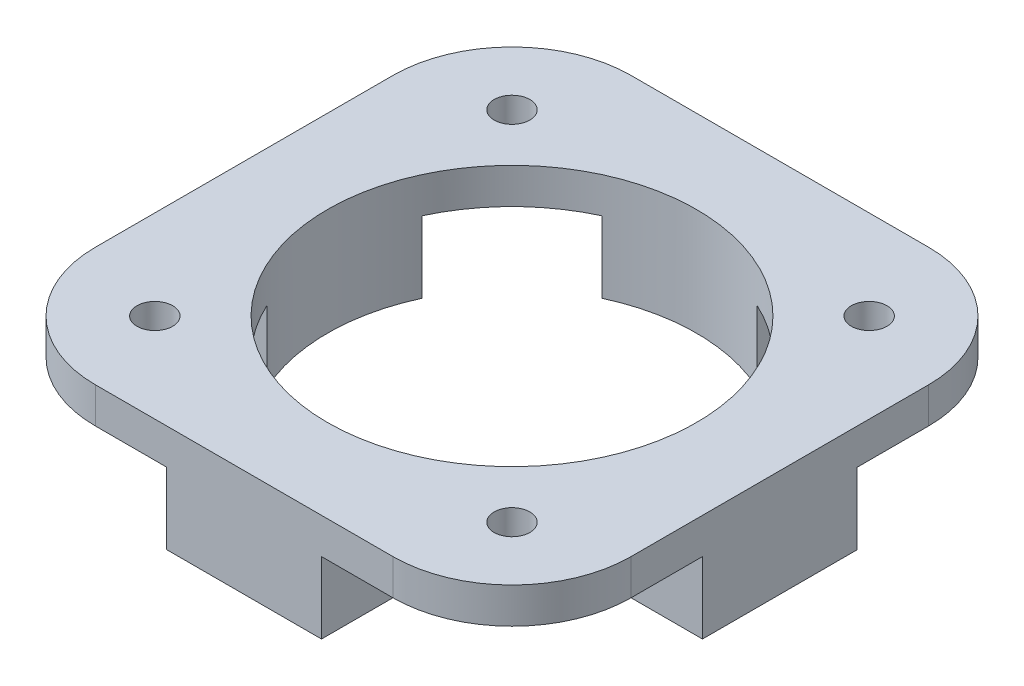
ISO-10303-21;
HEADER;
FILE_DESCRIPTION(('STEP AP214'),'2;1');
FILE_NAME('part.step','',(''),(''),'','','');
FILE_SCHEMA(('AUTOMOTIVE_DESIGN { 1 0 10303 214 1 1 1 1 }'));
ENDSEC;
DATA;
#1=APPLICATION_CONTEXT('core data for automotive mechanical design processes');
#2=APPLICATION_PROTOCOL_DEFINITION('international standard','automotive_design',2000,#1);
#3=PRODUCT_CONTEXT('',#1,'mechanical');
#4=PRODUCT('Part','Part','',(#3));
#5=PRODUCT_RELATED_PRODUCT_CATEGORY('part','',(#4));
#6=PRODUCT_DEFINITION_FORMATION('','',#4);
#7=PRODUCT_DEFINITION_CONTEXT('part definition',#1,'design');
#8=PRODUCT_DEFINITION('design','',#6,#7);
#9=PRODUCT_DEFINITION_SHAPE('','',#8);
#10=(LENGTH_UNIT() NAMED_UNIT(*) SI_UNIT(.MILLI.,.METRE.));
#11=(NAMED_UNIT(*) PLANE_ANGLE_UNIT() SI_UNIT($,.RADIAN.));
#12=(NAMED_UNIT(*) SI_UNIT($,.STERADIAN.) SOLID_ANGLE_UNIT());
#13=UNCERTAINTY_MEASURE_WITH_UNIT(LENGTH_MEASURE(1.E-05),#10,'distance_accuracy_value','');
#14=(GEOMETRIC_REPRESENTATION_CONTEXT(3) GLOBAL_UNCERTAINTY_ASSIGNED_CONTEXT((#13)) GLOBAL_UNIT_ASSIGNED_CONTEXT((#10,
#11,#12)) REPRESENTATION_CONTEXT('',''));
#15=CARTESIAN_POINT('',(0.,0.,0.));
#16=DIRECTION('',(0.,0.,1.));
#17=DIRECTION('',(1.,0.,0.));
#18=AXIS2_PLACEMENT_3D('',#15,#16,#17);
#19=CARTESIAN_POINT('',(6.99833531510106,-6.,-6.));
#20=DIRECTION('',(1.,0.,0.));
#21=DIRECTION('',(0.,0.,-1.));
#22=AXIS2_PLACEMENT_3D('',#19,#20,#21);
#23=PLANE('',#22);
#24=DIRECTION('',(0.,0.,-1.));
#25=VECTOR('',#24,1.);
#26=CARTESIAN_POINT('',(6.99833531510106,0.,-6.));
#27=LINE('',#26,#25);
#28=CARTESIAN_POINT('',(6.99833531510106,0.,-13.5729119643692));
#29=VERTEX_POINT('',#28);
#30=CARTESIAN_POINT('',(6.99833531510106,0.,-22.0016646848989));
#31=VERTEX_POINT('',#30);
#32=EDGE_CURVE('E64',#29,#31,#27,.T.);
#33=ORIENTED_EDGE('',*,*,#32,.F.);
#34=DIRECTION('',(0.,-1.,0.));
#35=VECTOR('',#34,1.);
#36=CARTESIAN_POINT('',(6.99833531510106,7.5,-13.5729119643692));
#37=LINE('',#36,#35);
#38=CARTESIAN_POINT('',(6.99833531510106,-6.,-13.5729119643692));
#39=VERTEX_POINT('',#38);
#40=EDGE_CURVE('E589',#29,#39,#37,.T.);
#41=ORIENTED_EDGE('',*,*,#40,.T.);
#42=DIRECTION('',(0.,0.,-1.));
#43=VECTOR('',#42,1.);
#44=CARTESIAN_POINT('',(6.99833531510106,-6.,-6.));
#45=LINE('',#44,#43);
#46=CARTESIAN_POINT('',(6.99833531510106,-6.,-22.0016646848989));
#47=VERTEX_POINT('',#46);
#48=EDGE_CURVE('E248',#39,#47,#45,.T.);
#49=ORIENTED_EDGE('',*,*,#48,.T.);
#50=DIRECTION('',(0.,1.,0.));
#51=VECTOR('',#50,1.);
#52=CARTESIAN_POINT('',(6.99833531510106,-6.,-22.0016646848989));
#53=LINE('',#52,#51);
#54=EDGE_CURVE('E280',#47,#31,#53,.T.);
#55=ORIENTED_EDGE('',*,*,#54,.T.);
#56=EDGE_LOOP('',(#33,#41,#49,#55));
#57=FACE_BOUND('',#56,.T.);
#58=ADVANCED_FACE('F39',(#57),#23,.T.);
#59=CARTESIAN_POINT('',(22.9983353151011,-6.,-6.));
#60=DIRECTION('',(0.,0.,-1.));
#61=DIRECTION('',(-1.,0.,0.));
#62=AXIS2_PLACEMENT_3D('',#59,#60,#61);
#63=PLANE('',#62);
#64=DIRECTION('',(-1.,0.,0.));
#65=VECTOR('',#64,1.);
#66=CARTESIAN_POINT('',(22.9983353151011,-6.,-6.));
#67=LINE('',#66,#65);
#68=CARTESIAN_POINT('',(22.9983353151011,-6.,-6.));
#69=VERTEX_POINT('',#68);
#70=CARTESIAN_POINT('',(14.5703514511247,-6.,-6.));
#71=VERTEX_POINT('',#70);
#72=EDGE_CURVE('E244',#69,#71,#67,.T.);
#73=ORIENTED_EDGE('',*,*,#72,.T.);
#74=DIRECTION('',(0.,-1.,0.));
#75=VECTOR('',#74,1.);
#76=CARTESIAN_POINT('',(14.5703514511247,7.5,-6.));
#77=LINE('',#76,#75);
#78=CARTESIAN_POINT('',(14.5703514511247,0.,-6.));
#79=VERTEX_POINT('',#78);
#80=EDGE_CURVE('E570',#71,#79,#77,.F.);
#81=ORIENTED_EDGE('',*,*,#80,.T.);
#82=DIRECTION('',(-1.,0.,0.));
#83=VECTOR('',#82,1.);
#84=CARTESIAN_POINT('',(22.9983353151011,0.,-6.));
#85=LINE('',#84,#83);
#86=CARTESIAN_POINT('',(22.9983353151011,0.,-6.));
#87=VERTEX_POINT('',#86);
#88=EDGE_CURVE('E273',#87,#79,#85,.T.);
#89=ORIENTED_EDGE('',*,*,#88,.F.);
#90=DIRECTION('',(0.,1.,0.));
#91=VECTOR('',#90,1.);
#92=CARTESIAN_POINT('',(22.9983353151011,-6.,-6.));
#93=LINE('',#92,#91);
#94=EDGE_CURVE('E284',#69,#87,#93,.T.);
#95=ORIENTED_EDGE('',*,*,#94,.F.);
#96=EDGE_LOOP('',(#73,#81,#89,#95));
#97=FACE_BOUND('',#96,.T.);
#98=ADVANCED_FACE('F490',(#97),#63,.T.);
#99=CARTESIAN_POINT('',(6.99833531510106,-6.,6.99833531510107));
#100=DIRECTION('',(0.,0.,1.));
#101=DIRECTION('',(1.,0.,0.));
#102=AXIS2_PLACEMENT_3D('',#99,#100,#101);
#103=PLANE('',#102);
#104=DIRECTION('',(1.,0.,0.));
#105=VECTOR('',#104,1.);
#106=CARTESIAN_POINT('',(6.99833531510106,0.,6.99833531510107));
#107=LINE('',#106,#105);
#108=CARTESIAN_POINT('',(14.5695825945714,0.,6.99833531510107));
#109=VERTEX_POINT('',#108);
#110=CARTESIAN_POINT('',(22.9983353151011,0.,6.99833531510107));
#111=VERTEX_POINT('',#110);
#112=EDGE_CURVE('E270',#109,#111,#107,.T.);
#113=ORIENTED_EDGE('',*,*,#112,.F.);
#114=DIRECTION('',(0.,-1.,0.));
#115=VECTOR('',#114,1.);
#116=CARTESIAN_POINT('',(14.5695825945714,7.5,6.99833531510107));
#117=LINE('',#116,#115);
#118=CARTESIAN_POINT('',(14.5695825945714,-6.,6.99833531510107));
#119=VERTEX_POINT('',#118);
#120=EDGE_CURVE('E563',#109,#119,#117,.T.);
#121=ORIENTED_EDGE('',*,*,#120,.T.);
#122=DIRECTION('',(1.,0.,0.));
#123=VECTOR('',#122,1.);
#124=CARTESIAN_POINT('',(6.99833531510106,-6.,6.99833531510107));
#125=LINE('',#124,#123);
#126=CARTESIAN_POINT('',(22.9983353151011,-6.,6.99833531510107));
#127=VERTEX_POINT('',#126);
#128=EDGE_CURVE('E237',#119,#127,#125,.T.);
#129=ORIENTED_EDGE('',*,*,#128,.T.);
#130=DIRECTION('',(0.,1.,0.));
#131=VECTOR('',#130,1.);
#132=CARTESIAN_POINT('',(22.9983353151011,-6.,6.99833531510107));
#133=LINE('',#132,#131);
#134=EDGE_CURVE('E287',#127,#111,#133,.T.);
#135=ORIENTED_EDGE('',*,*,#134,.T.);
#136=EDGE_LOOP('',(#113,#121,#129,#135));
#137=FACE_BOUND('',#136,.T.);
#138=ADVANCED_FACE('F496',(#137),#103,.T.);
#139=CARTESIAN_POINT('',(6.99833531510106,-6.,22.9983353151011));
#140=DIRECTION('',(1.,0.,0.));
#141=DIRECTION('',(0.,0.,-1.));
#142=AXIS2_PLACEMENT_3D('',#139,#140,#141);
#143=PLANE('',#142);
#144=DIRECTION('',(0.,0.,-1.));
#145=VECTOR('',#144,1.);
#146=CARTESIAN_POINT('',(6.99833531510106,-6.,22.9983353151011));
#147=LINE('',#146,#145);
#148=CARTESIAN_POINT('',(6.99833531510106,-6.,22.9983353151011));
#149=VERTEX_POINT('',#148);
#150=CARTESIAN_POINT('',(6.99833531510106,-6.,14.5695825945714));
#151=VERTEX_POINT('',#150);
#152=EDGE_CURVE('E228',#149,#151,#147,.T.);
#153=ORIENTED_EDGE('',*,*,#152,.T.);
#154=DIRECTION('',(0.,-1.,0.));
#155=VECTOR('',#154,1.);
#156=CARTESIAN_POINT('',(6.99833531510106,7.5,14.5695825945714));
#157=LINE('',#156,#155);
#158=CARTESIAN_POINT('',(6.99833531510106,0.,14.5695825945714));
#159=VERTEX_POINT('',#158);
#160=EDGE_CURVE('E56',#151,#159,#157,.F.);
#161=ORIENTED_EDGE('',*,*,#160,.T.);
#162=DIRECTION('',(0.,0.,-1.));
#163=VECTOR('',#162,1.);
#164=CARTESIAN_POINT('',(6.99833531510106,0.,22.9983353151011));
#165=LINE('',#164,#163);
#166=CARTESIAN_POINT('',(6.99833531510106,0.,22.9983353151011));
#167=VERTEX_POINT('',#166);
#168=EDGE_CURVE('E266',#167,#159,#165,.T.);
#169=ORIENTED_EDGE('',*,*,#168,.F.);
#170=DIRECTION('',(0.,1.,0.));
#171=VECTOR('',#170,1.);
#172=CARTESIAN_POINT('',(6.99833531510106,-6.,22.9983353151011));
#173=LINE('',#172,#171);
#174=EDGE_CURVE('E291',#149,#167,#173,.T.);
#175=ORIENTED_EDGE('',*,*,#174,.F.);
#176=EDGE_LOOP('',(#153,#161,#169,#175));
#177=FACE_BOUND('',#176,.T.);
#178=ADVANCED_FACE('F504',(#177),#143,.T.);
#179=CARTESIAN_POINT('',(-6.00166468489894,-6.,6.99833531510107));
#180=DIRECTION('',(-1.,0.,0.));
#181=DIRECTION('',(0.,0.,1.));
#182=AXIS2_PLACEMENT_3D('',#179,#180,#181);
#183=PLANE('',#182);
#184=DIRECTION('',(0.,0.,1.));
#185=VECTOR('',#184,1.);
#186=CARTESIAN_POINT('',(-6.00166468489894,0.,6.99833531510107));
#187=LINE('',#186,#185);
#188=CARTESIAN_POINT('',(-6.00166468489894,0.,14.5695825945714));
#189=VERTEX_POINT('',#188);
#190=CARTESIAN_POINT('',(-6.00166468489894,0.,22.9983353151011));
#191=VERTEX_POINT('',#190);
#192=EDGE_CURVE('E216',#189,#191,#187,.T.);
#193=ORIENTED_EDGE('',*,*,#192,.F.);
#194=DIRECTION('',(0.,-1.,0.));
#195=VECTOR('',#194,1.);
#196=CARTESIAN_POINT('',(-6.00166468489894,7.5,14.5695825945714));
#197=LINE('',#196,#195);
#198=CARTESIAN_POINT('',(-6.00166468489894,-6.,14.5695825945714));
#199=VERTEX_POINT('',#198);
#200=EDGE_CURVE('E201',#189,#199,#197,.T.);
#201=ORIENTED_EDGE('',*,*,#200,.T.);
#202=DIRECTION('',(0.,0.,1.));
#203=VECTOR('',#202,1.);
#204=CARTESIAN_POINT('',(-6.00166468489894,-6.,6.99833531510107));
#205=LINE('',#204,#203);
#206=CARTESIAN_POINT('',(-6.00166468489894,-6.,22.9983353151011));
#207=VERTEX_POINT('',#206);
#208=EDGE_CURVE('E214',#199,#207,#205,.T.);
#209=ORIENTED_EDGE('',*,*,#208,.T.);
#210=DIRECTION('',(0.,1.,0.));
#211=VECTOR('',#210,1.);
#212=CARTESIAN_POINT('',(-6.00166468489894,-6.,22.9983353151011));
#213=LINE('',#212,#211);
#214=EDGE_CURVE('E294',#207,#191,#213,.T.);
#215=ORIENTED_EDGE('',*,*,#214,.T.);
#216=EDGE_LOOP('',(#193,#201,#209,#215));
#217=FACE_BOUND('',#216,.T.);
#218=ADVANCED_FACE('F212',(#217),#183,.T.);
#219=CARTESIAN_POINT('',(-22.0016646848989,-6.,6.99833531510107));
#220=DIRECTION('',(0.,0.,1.));
#221=DIRECTION('',(1.,0.,0.));
#222=AXIS2_PLACEMENT_3D('',#219,#220,#221);
#223=PLANE('',#222);
#224=DIRECTION('',(1.,0.,0.));
#225=VECTOR('',#224,1.);
#226=CARTESIAN_POINT('',(-22.0016646848989,-6.,6.99833531510107));
#227=LINE('',#226,#225);
#228=CARTESIAN_POINT('',(-22.0016646848989,-6.,6.99833531510107));
#229=VERTEX_POINT('',#228);
#230=CARTESIAN_POINT('',(-13.5729119643692,-6.,6.99833531510107));
#231=VERTEX_POINT('',#230);
#232=EDGE_CURVE('E224',#229,#231,#227,.T.);
#233=ORIENTED_EDGE('',*,*,#232,.T.);
#234=DIRECTION('',(0.,-1.,0.));
#235=VECTOR('',#234,1.);
#236=CARTESIAN_POINT('',(-13.5729119643692,7.5,6.99833531510107));
#237=LINE('',#236,#235);
#238=CARTESIAN_POINT('',(-13.5729119643692,0.,6.99833531510107));
#239=VERTEX_POINT('',#238);
#240=EDGE_CURVE('E611',#231,#239,#237,.F.);
#241=ORIENTED_EDGE('',*,*,#240,.T.);
#242=DIRECTION('',(1.,0.,0.));
#243=VECTOR('',#242,1.);
#244=CARTESIAN_POINT('',(-22.0016646848989,0.,6.99833531510107));
#245=LINE('',#244,#243);
#246=CARTESIAN_POINT('',(-22.0016646848989,0.,6.99833531510107));
#247=VERTEX_POINT('',#246);
#248=EDGE_CURVE('E260',#247,#239,#245,.T.);
#249=ORIENTED_EDGE('',*,*,#248,.F.);
#250=DIRECTION('',(0.,1.,0.));
#251=VECTOR('',#250,1.);
#252=CARTESIAN_POINT('',(-22.0016646848989,-6.,6.99833531510107));
#253=LINE('',#252,#251);
#254=EDGE_CURVE('E297',#229,#247,#253,.T.);
#255=ORIENTED_EDGE('',*,*,#254,.F.);
#256=EDGE_LOOP('',(#233,#241,#249,#255));
#257=FACE_BOUND('',#256,.T.);
#258=ADVANCED_FACE('F511',(#257),#223,.T.);
#259=CARTESIAN_POINT('',(-6.,-6.,-6.));
#260=DIRECTION('',(0.,0.,-1.));
#261=DIRECTION('',(-1.,0.,0.));
#262=AXIS2_PLACEMENT_3D('',#259,#260,#261);
#263=PLANE('',#262);
#264=DIRECTION('',(-1.,0.,0.));
#265=VECTOR('',#264,1.);
#266=CARTESIAN_POINT('',(-6.,0.,-6.));
#267=LINE('',#266,#265);
#268=CARTESIAN_POINT('',(-13.5736808209226,0.,-6.));
#269=VERTEX_POINT('',#268);
#270=CARTESIAN_POINT('',(-22.0016646848989,0.,-6.));
#271=VERTEX_POINT('',#270);
#272=EDGE_CURVE('E256',#269,#271,#267,.T.);
#273=ORIENTED_EDGE('',*,*,#272,.F.);
#274=DIRECTION('',(0.,-1.,0.));
#275=VECTOR('',#274,1.);
#276=CARTESIAN_POINT('',(-13.5736808209226,7.5,-6.));
#277=LINE('',#276,#275);
#278=CARTESIAN_POINT('',(-13.5736808209226,-6.,-6.));
#279=VERTEX_POINT('',#278);
#280=EDGE_CURVE('E573',#269,#279,#277,.T.);
#281=ORIENTED_EDGE('',*,*,#280,.T.);
#282=DIRECTION('',(-1.,0.,0.));
#283=VECTOR('',#282,1.);
#284=CARTESIAN_POINT('',(-6.,-6.,-6.));
#285=LINE('',#284,#283);
#286=CARTESIAN_POINT('',(-22.0016646848989,-6.,-6.));
#287=VERTEX_POINT('',#286);
#288=EDGE_CURVE('E602',#279,#287,#285,.T.);
#289=ORIENTED_EDGE('',*,*,#288,.T.);
#290=DIRECTION('',(0.,1.,0.));
#291=VECTOR('',#290,1.);
#292=CARTESIAN_POINT('',(-22.0016646848989,-6.,-6.));
#293=LINE('',#292,#291);
#294=EDGE_CURVE('E300',#287,#271,#293,.T.);
#295=ORIENTED_EDGE('',*,*,#294,.T.);
#296=EDGE_LOOP('',(#273,#281,#289,#295));
#297=FACE_BOUND('',#296,.T.);
#298=ADVANCED_FACE('F514',(#297),#263,.T.);
#299=CARTESIAN_POINT('',(-6.,-6.,-22.0016646848989));
#300=DIRECTION('',(-1.,0.,0.));
#301=DIRECTION('',(0.,0.,1.));
#302=AXIS2_PLACEMENT_3D('',#299,#300,#301);
#303=PLANE('',#302);
#304=DIRECTION('',(0.,0.,1.));
#305=VECTOR('',#304,1.);
#306=CARTESIAN_POINT('',(-6.,-6.,-22.0016646848989));
#307=LINE('',#306,#305);
#308=CARTESIAN_POINT('',(-6.,-6.,-22.0016646848989));
#309=VERTEX_POINT('',#308);
#310=CARTESIAN_POINT('',(-6.,-6.,-13.5736808209226));
#311=VERTEX_POINT('',#310);
#312=EDGE_CURVE('E598',#309,#311,#307,.T.);
#313=ORIENTED_EDGE('',*,*,#312,.T.);
#314=DIRECTION('',(0.,-1.,0.));
#315=VECTOR('',#314,1.);
#316=CARTESIAN_POINT('',(-6.,7.5,-13.5736808209226));
#317=LINE('',#316,#315);
#318=CARTESIAN_POINT('',(-6.,0.,-13.5736808209226));
#319=VERTEX_POINT('',#318);
#320=EDGE_CURVE('E585',#311,#319,#317,.F.);
#321=ORIENTED_EDGE('',*,*,#320,.T.);
#322=DIRECTION('',(0.,0.,1.));
#323=VECTOR('',#322,1.);
#324=CARTESIAN_POINT('',(-6.,0.,-22.0016646848989));
#325=LINE('',#324,#323);
#326=CARTESIAN_POINT('',(-6.,0.,-22.0016646848989));
#327=VERTEX_POINT('',#326);
#328=EDGE_CURVE('E252',#327,#319,#325,.T.);
#329=ORIENTED_EDGE('',*,*,#328,.F.);
#330=DIRECTION('',(0.,1.,0.));
#331=VECTOR('',#330,1.);
#332=CARTESIAN_POINT('',(-6.,-6.,-22.0016646848989));
#333=LINE('',#332,#331);
#334=EDGE_CURVE('E251',#309,#327,#333,.T.);
#335=ORIENTED_EDGE('',*,*,#334,.F.);
#336=EDGE_LOOP('',(#313,#321,#329,#335));
#337=FACE_BOUND('',#336,.T.);
#338=ADVANCED_FACE('F518',(#337),#303,.T.);
#339=CARTESIAN_POINT('',(0.,-6.,0.));
#340=DIRECTION('',(0.,1.,0.));
#341=DIRECTION('',(0.,0.,1.));
#342=AXIS2_PLACEMENT_3D('',#339,#340,#341);
#343=PLANE('',#342);
#344=CARTESIAN_POINT('',(0.498335315101075,-6.,0.498335315101071));
#345=DIRECTION('',(0.,1.,0.));
#346=DIRECTION('',(0.,0.,1.));
#347=AXIS2_PLACEMENT_3D('',#344,#345,#346);
#348=CIRCLE('',#347,15.5);
#349=EDGE_CURVE('E11',#231,#279,#348,.F.);
#350=ORIENTED_EDGE('',*,*,#349,.F.);
#351=ORIENTED_EDGE('',*,*,#232,.F.);
#352=DIRECTION('',(0.,0.,1.));
#353=VECTOR('',#352,1.);
#354=CARTESIAN_POINT('',(-22.0016646848989,-6.,-6.));
#355=LINE('',#354,#353);
#356=EDGE_CURVE('E231',#287,#229,#355,.T.);
#357=ORIENTED_EDGE('',*,*,#356,.F.);
#358=ORIENTED_EDGE('',*,*,#288,.F.);
#359=EDGE_LOOP('',(#350,#351,#357,#358));
#360=FACE_BOUND('',#359,.T.);
#361=ADVANCED_FACE('F522',(#360),#343,.F.);
#362=EDGE_CURVE('E49',#311,#39,#348,.F.);
#363=ORIENTED_EDGE('',*,*,#362,.F.);
#364=ORIENTED_EDGE('',*,*,#312,.F.);
#365=DIRECTION('',(-1.,0.,0.));
#366=VECTOR('',#365,1.);
#367=CARTESIAN_POINT('',(-6.,-6.,-22.0016646848989));
#368=LINE('',#367,#366);
#369=EDGE_CURVE('E279',#47,#309,#368,.T.);
#370=ORIENTED_EDGE('',*,*,#369,.F.);
#371=ORIENTED_EDGE('',*,*,#48,.F.);
#372=EDGE_LOOP('',(#363,#364,#370,#371));
#373=FACE_BOUND('',#372,.T.);
#374=ADVANCED_FACE('F633',(#373),#343,.F.);
#375=EDGE_CURVE('E208',#71,#119,#348,.F.);
#376=ORIENTED_EDGE('',*,*,#375,.F.);
#377=ORIENTED_EDGE('',*,*,#72,.F.);
#378=DIRECTION('',(0.,0.,-1.));
#379=VECTOR('',#378,1.);
#380=CARTESIAN_POINT('',(22.9983353151011,-6.,-6.));
#381=LINE('',#380,#379);
#382=EDGE_CURVE('E240',#127,#69,#381,.T.);
#383=ORIENTED_EDGE('',*,*,#382,.F.);
#384=ORIENTED_EDGE('',*,*,#128,.F.);
#385=EDGE_LOOP('',(#376,#377,#383,#384));
#386=FACE_BOUND('',#385,.T.);
#387=ADVANCED_FACE('F544',(#386),#343,.F.);
#388=CARTESIAN_POINT('',(12.9983353151011,0.,-12.0016646848989));
#389=DIRECTION('',(0.,1.,0.));
#390=DIRECTION('',(0.,0.,1.));
#391=AXIS2_PLACEMENT_3D('',#388,#389,#390);
#392=PLANE('',#391);
#393=CARTESIAN_POINT('',(0.498335315101075,0.,0.498335315101071));
#394=DIRECTION('',(0.,1.,0.));
#395=DIRECTION('',(0.,0.,1.));
#396=AXIS2_PLACEMENT_3D('',#393,#394,#395);
#397=CIRCLE('',#396,15.5);
#398=EDGE_CURVE('E577',#269,#319,#397,.F.);
#399=ORIENTED_EDGE('',*,*,#398,.F.);
#400=ORIENTED_EDGE('',*,*,#272,.T.);
#401=DIRECTION('',(0.,0.,1.));
#402=VECTOR('',#401,1.);
#403=CARTESIAN_POINT('',(-22.0016646848989,0.,12.998335315101));
#404=LINE('',#403,#402);
#405=CARTESIAN_POINT('',(-22.0016646848989,0.,-12.0016646848989));
#406=VERTEX_POINT('',#405);
#407=EDGE_CURVE('E377',#406,#271,#404,.T.);
#408=ORIENTED_EDGE('',*,*,#407,.F.);
#409=CARTESIAN_POINT('',(-12.0016646848989,0.,-12.0016646848989));
#410=DIRECTION('',(0.,1.,0.));
#411=DIRECTION('',(0.,0.,1.));
#412=AXIS2_PLACEMENT_3D('',#409,#410,#411);
#413=CIRCLE('',#412,10.);
#414=CARTESIAN_POINT('',(-12.0016646848989,0.,-22.0016646848989));
#415=VERTEX_POINT('',#414);
#416=EDGE_CURVE('E373',#415,#406,#413,.T.);
#417=ORIENTED_EDGE('',*,*,#416,.F.);
#418=DIRECTION('',(-1.,0.,0.));
#419=VECTOR('',#418,1.);
#420=CARTESIAN_POINT('',(12.998335315101,0.,-22.0016646848989));
#421=LINE('',#420,#419);
#422=EDGE_CURVE('E368',#327,#415,#421,.T.);
#423=ORIENTED_EDGE('',*,*,#422,.F.);
#424=ORIENTED_EDGE('',*,*,#328,.T.);
#425=EDGE_LOOP('',(#399,#400,#408,#417,#423,#424));
#426=FACE_BOUND('',#425,.T.);
#427=CARTESIAN_POINT('',(-14.5016646848989,0.,-14.5016646848989));
#428=DIRECTION('',(0.,1.,0.));
#429=DIRECTION('',(0.,0.,1.));
#430=AXIS2_PLACEMENT_3D('',#427,#428,#429);
#431=CIRCLE('',#430,1.5);
#432=CARTESIAN_POINT('',(-14.5016646848989,0.,-13.0016646848989));
#433=VERTEX_POINT('',#432);
#434=EDGE_CURVE('E326',#433,#433,#431,.T.);
#435=ORIENTED_EDGE('',*,*,#434,.T.);
#436=EDGE_LOOP('',(#435));
#437=FACE_BOUND('',#436,.T.);
#438=ADVANCED_FACE('F453',(#426,#437),#392,.F.);
#439=CARTESIAN_POINT('',(0.498335315101075,0.,0.498335315101071));
#440=DIRECTION('',(0.,1.,0.));
#441=DIRECTION('',(0.,0.,1.));
#442=AXIS2_PLACEMENT_3D('',#439,#440,#441);
#443=CIRCLE('',#442,15.5);
#444=EDGE_CURVE('E560',#189,#239,#443,.F.);
#445=ORIENTED_EDGE('',*,*,#444,.F.);
#446=ORIENTED_EDGE('',*,*,#192,.T.);
#447=DIRECTION('',(1.,0.,0.));
#448=VECTOR('',#447,1.);
#449=CARTESIAN_POINT('',(12.998335315101,0.,22.9983353151011));
#450=LINE('',#449,#448);
#451=CARTESIAN_POINT('',(-12.0016646848989,0.,22.9983353151011));
#452=VERTEX_POINT('',#451);
#453=EDGE_CURVE('E385',#452,#191,#450,.T.);
#454=ORIENTED_EDGE('',*,*,#453,.F.);
#455=CARTESIAN_POINT('',(-12.0016646848989,0.,12.9983353151011));
#456=DIRECTION('',(0.,1.,0.));
#457=DIRECTION('',(0.,0.,-1.));
#458=AXIS2_PLACEMENT_3D('',#455,#456,#457);
#459=CIRCLE('',#458,10.);
#460=CARTESIAN_POINT('',(-22.0016646848989,0.,12.998335315101));
#461=VERTEX_POINT('',#460);
#462=EDGE_CURVE('E381',#461,#452,#459,.T.);
#463=ORIENTED_EDGE('',*,*,#462,.F.);
#464=EDGE_CURVE('E376',#247,#461,#404,.T.);
#465=ORIENTED_EDGE('',*,*,#464,.F.);
#466=ORIENTED_EDGE('',*,*,#248,.T.);
#467=EDGE_LOOP('',(#445,#446,#454,#463,#465,#466));
#468=FACE_BOUND('',#467,.T.);
#469=CARTESIAN_POINT('',(-14.5016646848989,0.,15.4983353151011));
#470=DIRECTION('',(0.,1.,0.));
#471=DIRECTION('',(0.,0.,-1.));
#472=AXIS2_PLACEMENT_3D('',#469,#470,#471);
#473=CIRCLE('',#472,1.5);
#474=CARTESIAN_POINT('',(-14.5016646848989,0.,13.9983353151011));
#475=VERTEX_POINT('',#474);
#476=EDGE_CURVE('E283',#475,#475,#473,.T.);
#477=ORIENTED_EDGE('',*,*,#476,.T.);
#478=EDGE_LOOP('',(#477));
#479=FACE_BOUND('',#478,.T.);
#480=ADVANCED_FACE('F543',(#468,#479),#392,.F.);
#481=CARTESIAN_POINT('',(0.498335315101075,0.,0.498335315101071));
#482=DIRECTION('',(0.,1.,0.));
#483=DIRECTION('',(0.,0.,1.));
#484=AXIS2_PLACEMENT_3D('',#481,#482,#483);
#485=CIRCLE('',#484,15.5);
#486=EDGE_CURVE('E553',#109,#159,#485,.F.);
#487=ORIENTED_EDGE('',*,*,#486,.F.);
#488=ORIENTED_EDGE('',*,*,#112,.T.);
#489=DIRECTION('',(0.,0.,-1.));
#490=VECTOR('',#489,1.);
#491=CARTESIAN_POINT('',(22.9983353151011,0.,12.998335315101));
#492=LINE('',#491,#490);
#493=CARTESIAN_POINT('',(22.9983353151011,0.,12.998335315101));
#494=VERTEX_POINT('',#493);
#495=EDGE_CURVE('E343',#494,#111,#492,.T.);
#496=ORIENTED_EDGE('',*,*,#495,.F.);
#497=CARTESIAN_POINT('',(12.9983353151011,0.,12.9983353151011));
#498=DIRECTION('',(0.,1.,0.));
#499=DIRECTION('',(0.,0.,1.));
#500=AXIS2_PLACEMENT_3D('',#497,#498,#499);
#501=CIRCLE('',#500,10.);
#502=CARTESIAN_POINT('',(12.998335315101,0.,22.9983353151011));
#503=VERTEX_POINT('',#502);
#504=EDGE_CURVE('E389',#503,#494,#501,.T.);
#505=ORIENTED_EDGE('',*,*,#504,.F.);
#506=EDGE_CURVE('E384',#167,#503,#450,.T.);
#507=ORIENTED_EDGE('',*,*,#506,.F.);
#508=ORIENTED_EDGE('',*,*,#168,.T.);
#509=EDGE_LOOP('',(#487,#488,#496,#505,#507,#508));
#510=FACE_BOUND('',#509,.T.);
#511=CARTESIAN_POINT('',(15.4983353151011,0.,15.4983353151011));
#512=DIRECTION('',(0.,1.,0.));
#513=DIRECTION('',(0.,0.,1.));
#514=AXIS2_PLACEMENT_3D('',#511,#512,#513);
#515=CIRCLE('',#514,1.5);
#516=CARTESIAN_POINT('',(15.4983353151011,0.,16.9983353151011));
#517=VERTEX_POINT('',#516);
#518=EDGE_CURVE('E310',#517,#517,#515,.T.);
#519=ORIENTED_EDGE('',*,*,#518,.T.);
#520=EDGE_LOOP('',(#519));
#521=FACE_BOUND('',#520,.T.);
#522=ADVANCED_FACE('F536',(#510,#521),#392,.F.);
#523=CARTESIAN_POINT('',(12.9983353151011,3.,-12.0016646848989));
#524=DIRECTION('',(0.,1.,0.));
#525=DIRECTION('',(0.,0.,1.));
#526=AXIS2_PLACEMENT_3D('',#523,#524,#525);
#527=PLANE('',#526);
#528=CARTESIAN_POINT('',(0.498335315101075,3.,0.498335315101071));
#529=DIRECTION('',(0.,1.,0.));
#530=DIRECTION('',(0.,0.,1.));
#531=AXIS2_PLACEMENT_3D('',#528,#529,#530);
#532=CIRCLE('',#531,15.5);
#533=CARTESIAN_POINT('',(0.498335315101075,3.,15.9983353151011));
#534=VERTEX_POINT('',#533);
#535=EDGE_CURVE('E257',#534,#534,#532,.F.);
#536=ORIENTED_EDGE('',*,*,#535,.T.);
#537=EDGE_LOOP('',(#536));
#538=FACE_BOUND('',#537,.T.);
#539=CARTESIAN_POINT('',(15.4983353151011,3.,15.4983353151011));
#540=DIRECTION('',(0.,1.,0.));
#541=DIRECTION('',(0.,0.,1.));
#542=AXIS2_PLACEMENT_3D('',#539,#540,#541);
#543=CIRCLE('',#542,1.5);
#544=CARTESIAN_POINT('',(15.4983353151011,3.,16.9983353151011));
#545=VERTEX_POINT('',#544);
#546=EDGE_CURVE('E314',#545,#545,#543,.T.);
#547=ORIENTED_EDGE('',*,*,#546,.F.);
#548=EDGE_LOOP('',(#547));
#549=FACE_BOUND('',#548,.T.);
#550=CARTESIAN_POINT('',(-14.5016646848989,3.,-14.5016646848989));
#551=DIRECTION('',(0.,1.,0.));
#552=DIRECTION('',(0.,0.,1.));
#553=AXIS2_PLACEMENT_3D('',#550,#551,#552);
#554=CIRCLE('',#553,1.5);
#555=CARTESIAN_POINT('',(-14.5016646848989,3.,-13.0016646848989));
#556=VERTEX_POINT('',#555);
#557=EDGE_CURVE('E330',#556,#556,#554,.T.);
#558=ORIENTED_EDGE('',*,*,#557,.F.);
#559=EDGE_LOOP('',(#558));
#560=FACE_BOUND('',#559,.T.);
#561=CARTESIAN_POINT('',(12.9983353151011,3.,-12.0016646848989));
#562=DIRECTION('',(0.,1.,0.));
#563=DIRECTION('',(0.,0.,1.));
#564=AXIS2_PLACEMENT_3D('',#561,#562,#563);
#565=CIRCLE('',#564,10.);
#566=CARTESIAN_POINT('',(22.9983353151011,3.,-12.0016646848989));
#567=VERTEX_POINT('',#566);
#568=CARTESIAN_POINT('',(12.998335315101,3.,-22.0016646848989));
#569=VERTEX_POINT('',#568);
#570=EDGE_CURVE('E338',#567,#569,#565,.T.);
#571=ORIENTED_EDGE('',*,*,#570,.T.);
#572=DIRECTION('',(-1.,0.,0.));
#573=VECTOR('',#572,1.);
#574=CARTESIAN_POINT('',(12.998335315101,3.,-22.0016646848989));
#575=LINE('',#574,#573);
#576=CARTESIAN_POINT('',(-12.0016646848989,3.,-22.0016646848989));
#577=VERTEX_POINT('',#576);
#578=EDGE_CURVE('E342',#569,#577,#575,.T.);
#579=ORIENTED_EDGE('',*,*,#578,.T.);
#580=CARTESIAN_POINT('',(-12.0016646848989,3.,-12.0016646848989));
#581=DIRECTION('',(0.,1.,0.));
#582=DIRECTION('',(0.,0.,1.));
#583=AXIS2_PLACEMENT_3D('',#580,#581,#582);
#584=CIRCLE('',#583,10.);
#585=CARTESIAN_POINT('',(-22.0016646848989,3.,-12.0016646848989));
#586=VERTEX_POINT('',#585);
#587=EDGE_CURVE('E346',#577,#586,#584,.T.);
#588=ORIENTED_EDGE('',*,*,#587,.T.);
#589=DIRECTION('',(0.,0.,1.));
#590=VECTOR('',#589,1.);
#591=CARTESIAN_POINT('',(-22.0016646848989,3.,12.998335315101));
#592=LINE('',#591,#590);
#593=CARTESIAN_POINT('',(-22.0016646848989,3.,12.998335315101));
#594=VERTEX_POINT('',#593);
#595=EDGE_CURVE('E349',#586,#594,#592,.T.);
#596=ORIENTED_EDGE('',*,*,#595,.T.);
#597=CARTESIAN_POINT('',(-12.0016646848989,3.,12.9983353151011));
#598=DIRECTION('',(0.,1.,0.));
#599=DIRECTION('',(0.,0.,-1.));
#600=AXIS2_PLACEMENT_3D('',#597,#598,#599);
#601=CIRCLE('',#600,10.);
#602=CARTESIAN_POINT('',(-12.0016646848989,3.,22.9983353151011));
#603=VERTEX_POINT('',#602);
#604=EDGE_CURVE('E352',#594,#603,#601,.T.);
#605=ORIENTED_EDGE('',*,*,#604,.T.);
#606=DIRECTION('',(1.,0.,0.));
#607=VECTOR('',#606,1.);
#608=CARTESIAN_POINT('',(12.998335315101,3.,22.9983353151011));
#609=LINE('',#608,#607);
#610=CARTESIAN_POINT('',(12.998335315101,3.,22.9983353151011));
#611=VERTEX_POINT('',#610);
#612=EDGE_CURVE('E355',#603,#611,#609,.T.);
#613=ORIENTED_EDGE('',*,*,#612,.T.);
#614=CARTESIAN_POINT('',(12.9983353151011,3.,12.9983353151011));
#615=DIRECTION('',(0.,1.,0.));
#616=DIRECTION('',(0.,0.,1.));
#617=AXIS2_PLACEMENT_3D('',#614,#615,#616);
#618=CIRCLE('',#617,10.);
#619=CARTESIAN_POINT('',(22.9983353151011,3.,12.998335315101));
#620=VERTEX_POINT('',#619);
#621=EDGE_CURVE('E358',#611,#620,#618,.T.);
#622=ORIENTED_EDGE('',*,*,#621,.T.);
#623=DIRECTION('',(0.,0.,-1.));
#624=VECTOR('',#623,1.);
#625=CARTESIAN_POINT('',(22.9983353151011,3.,12.998335315101));
#626=LINE('',#625,#624);
#627=EDGE_CURVE('E361',#620,#567,#626,.T.);
#628=ORIENTED_EDGE('',*,*,#627,.T.);
#629=EDGE_LOOP('',(#571,#579,#588,#596,#605,#613,#622,#628));
#630=FACE_BOUND('',#629,.T.);
#631=CARTESIAN_POINT('',(15.4983353151011,3.,-14.5016646848989));
#632=DIRECTION('',(0.,1.,0.));
#633=DIRECTION('',(0.,0.,-1.));
#634=AXIS2_PLACEMENT_3D('',#631,#632,#633);
#635=CIRCLE('',#634,1.5);
#636=CARTESIAN_POINT('',(15.4983353151011,3.,-16.0016646848989));
#637=VERTEX_POINT('',#636);
#638=EDGE_CURVE('E322',#637,#637,#635,.T.);
#639=ORIENTED_EDGE('',*,*,#638,.F.);
#640=EDGE_LOOP('',(#639));
#641=FACE_BOUND('',#640,.T.);
#642=CARTESIAN_POINT('',(-14.5016646848989,3.,15.4983353151011));
#643=DIRECTION('',(0.,1.,0.));
#644=DIRECTION('',(0.,0.,-1.));
#645=AXIS2_PLACEMENT_3D('',#642,#643,#644);
#646=CIRCLE('',#645,1.5);
#647=CARTESIAN_POINT('',(-14.5016646848989,3.,13.9983353151011));
#648=VERTEX_POINT('',#647);
#649=EDGE_CURVE('E306',#648,#648,#646,.T.);
#650=ORIENTED_EDGE('',*,*,#649,.F.);
#651=EDGE_LOOP('',(#650));
#652=FACE_BOUND('',#651,.T.);
#653=ADVANCED_FACE('F465',(#538,#549,#560,#630,#641,#652),#527,.T.);
#654=CARTESIAN_POINT('',(0.498335315101075,0.,0.498335315101071));
#655=DIRECTION('',(0.,1.,0.));
#656=DIRECTION('',(0.,0.,1.));
#657=AXIS2_PLACEMENT_3D('',#654,#655,#656);
#658=CIRCLE('',#657,15.5);
#659=EDGE_CURVE('E572',#29,#79,#658,.F.);
#660=ORIENTED_EDGE('',*,*,#659,.F.);
#661=ORIENTED_EDGE('',*,*,#32,.T.);
#662=CARTESIAN_POINT('',(12.998335315101,0.,-22.0016646848989));
#663=VERTEX_POINT('',#662);
#664=EDGE_CURVE('E369',#663,#31,#421,.T.);
#665=ORIENTED_EDGE('',*,*,#664,.F.);
#666=CARTESIAN_POINT('',(12.9983353151011,0.,-12.0016646848989));
#667=DIRECTION('',(0.,1.,0.));
#668=DIRECTION('',(0.,0.,1.));
#669=AXIS2_PLACEMENT_3D('',#666,#667,#668);
#670=CIRCLE('',#669,10.);
#671=CARTESIAN_POINT('',(22.9983353151011,0.,-12.0016646848989));
#672=VERTEX_POINT('',#671);
#673=EDGE_CURVE('E334',#672,#663,#670,.T.);
#674=ORIENTED_EDGE('',*,*,#673,.F.);
#675=EDGE_CURVE('E392',#87,#672,#492,.T.);
#676=ORIENTED_EDGE('',*,*,#675,.F.);
#677=ORIENTED_EDGE('',*,*,#88,.T.);
#678=EDGE_LOOP('',(#660,#661,#665,#674,#676,#677));
#679=FACE_BOUND('',#678,.T.);
#680=CARTESIAN_POINT('',(15.4983353151011,0.,-14.5016646848989));
#681=DIRECTION('',(0.,1.,0.));
#682=DIRECTION('',(0.,0.,-1.));
#683=AXIS2_PLACEMENT_3D('',#680,#681,#682);
#684=CIRCLE('',#683,1.5);
#685=CARTESIAN_POINT('',(15.4983353151011,0.,-16.0016646848989));
#686=VERTEX_POINT('',#685);
#687=EDGE_CURVE('E318',#686,#686,#684,.T.);
#688=ORIENTED_EDGE('',*,*,#687,.T.);
#689=EDGE_LOOP('',(#688));
#690=FACE_BOUND('',#689,.T.);
#691=ADVANCED_FACE('F434',(#679,#690),#392,.F.);
#692=CARTESIAN_POINT('',(12.9983353151011,3.,-12.0016646848989));
#693=DIRECTION('',(0.,-1.,0.));
#694=DIRECTION('',(0.,0.,-1.));
#695=AXIS2_PLACEMENT_3D('',#692,#693,#694);
#696=CYLINDRICAL_SURFACE('',#695,10.);
#697=ORIENTED_EDGE('',*,*,#673,.T.);
#698=DIRECTION('',(0.,-1.,0.));
#699=VECTOR('',#698,1.);
#700=CARTESIAN_POINT('',(12.998335315101,3.,-22.0016646848989));
#701=LINE('',#700,#699);
#702=EDGE_CURVE('E209',#569,#663,#701,.T.);
#703=ORIENTED_EDGE('',*,*,#702,.F.);
#704=ORIENTED_EDGE('',*,*,#570,.F.);
#705=DIRECTION('',(0.,-1.,0.));
#706=VECTOR('',#705,1.);
#707=CARTESIAN_POINT('',(22.9983353151011,3.,-12.0016646848989));
#708=LINE('',#707,#706);
#709=EDGE_CURVE('E364',#567,#672,#708,.T.);
#710=ORIENTED_EDGE('',*,*,#709,.T.);
#711=EDGE_LOOP('',(#697,#703,#704,#710));
#712=FACE_BOUND('',#711,.T.);
#713=ADVANCED_FACE('F41',(#712),#696,.T.);
#714=CARTESIAN_POINT('',(12.998335315101,3.,-22.0016646848989));
#715=DIRECTION('',(0.,0.,1.));
#716=DIRECTION('',(1.,0.,0.));
#717=AXIS2_PLACEMENT_3D('',#714,#715,#716);
#718=PLANE('',#717);
#719=ORIENTED_EDGE('',*,*,#664,.T.);
#720=ORIENTED_EDGE('',*,*,#54,.F.);
#721=ORIENTED_EDGE('',*,*,#369,.T.);
#722=ORIENTED_EDGE('',*,*,#334,.T.);
#723=ORIENTED_EDGE('',*,*,#422,.T.);
#724=DIRECTION('',(0.,-1.,0.));
#725=VECTOR('',#724,1.);
#726=CARTESIAN_POINT('',(-12.0016646848989,3.,-22.0016646848989));
#727=LINE('',#726,#725);
#728=EDGE_CURVE('E419',#577,#415,#727,.T.);
#729=ORIENTED_EDGE('',*,*,#728,.F.);
#730=ORIENTED_EDGE('',*,*,#578,.F.);
#731=ORIENTED_EDGE('',*,*,#702,.T.);
#732=EDGE_LOOP('',(#719,#720,#721,#722,#723,#729,#730,#731));
#733=FACE_BOUND('',#732,.T.);
#734=ADVANCED_FACE('F426',(#733),#718,.F.);
#735=CARTESIAN_POINT('',(-12.0016646848989,3.,-12.0016646848989));
#736=DIRECTION('',(0.,-1.,0.));
#737=DIRECTION('',(0.,0.,-1.));
#738=AXIS2_PLACEMENT_3D('',#735,#736,#737);
#739=CYLINDRICAL_SURFACE('',#738,10.);
#740=ORIENTED_EDGE('',*,*,#416,.T.);
#741=DIRECTION('',(0.,-1.,0.));
#742=VECTOR('',#741,1.);
#743=CARTESIAN_POINT('',(-22.0016646848989,3.,-12.0016646848989));
#744=LINE('',#743,#742);
#745=EDGE_CURVE('E415',#586,#406,#744,.T.);
#746=ORIENTED_EDGE('',*,*,#745,.F.);
#747=ORIENTED_EDGE('',*,*,#587,.F.);
#748=ORIENTED_EDGE('',*,*,#728,.T.);
#749=EDGE_LOOP('',(#740,#746,#747,#748));
#750=FACE_BOUND('',#749,.T.);
#751=ADVANCED_FACE('F449',(#750),#739,.T.);
#752=CARTESIAN_POINT('',(-22.0016646848989,3.,12.998335315101));
#753=DIRECTION('',(1.,0.,0.));
#754=DIRECTION('',(0.,0.,-1.));
#755=AXIS2_PLACEMENT_3D('',#752,#753,#754);
#756=PLANE('',#755);
#757=ORIENTED_EDGE('',*,*,#407,.T.);
#758=ORIENTED_EDGE('',*,*,#294,.F.);
#759=ORIENTED_EDGE('',*,*,#356,.T.);
#760=ORIENTED_EDGE('',*,*,#254,.T.);
#761=ORIENTED_EDGE('',*,*,#464,.T.);
#762=DIRECTION('',(0.,-1.,0.));
#763=VECTOR('',#762,1.);
#764=CARTESIAN_POINT('',(-22.0016646848989,3.,12.998335315101));
#765=LINE('',#764,#763);
#766=EDGE_CURVE('E411',#594,#461,#765,.T.);
#767=ORIENTED_EDGE('',*,*,#766,.F.);
#768=ORIENTED_EDGE('',*,*,#595,.F.);
#769=ORIENTED_EDGE('',*,*,#745,.T.);
#770=EDGE_LOOP('',(#757,#758,#759,#760,#761,#767,#768,#769));
#771=FACE_BOUND('',#770,.T.);
#772=ADVANCED_FACE('F458',(#771),#756,.F.);
#773=CARTESIAN_POINT('',(-12.0016646848989,3.,12.9983353151011));
#774=DIRECTION('',(0.,-1.,0.));
#775=DIRECTION('',(0.,0.,-1.));
#776=AXIS2_PLACEMENT_3D('',#773,#774,#775);
#777=CYLINDRICAL_SURFACE('',#776,10.);
#778=ORIENTED_EDGE('',*,*,#462,.T.);
#779=DIRECTION('',(0.,-1.,0.));
#780=VECTOR('',#779,1.);
#781=CARTESIAN_POINT('',(-12.0016646848989,3.,22.9983353151011));
#782=LINE('',#781,#780);
#783=EDGE_CURVE('E407',#603,#452,#782,.T.);
#784=ORIENTED_EDGE('',*,*,#783,.F.);
#785=ORIENTED_EDGE('',*,*,#604,.F.);
#786=ORIENTED_EDGE('',*,*,#766,.T.);
#787=EDGE_LOOP('',(#778,#784,#785,#786));
#788=FACE_BOUND('',#787,.T.);
#789=ADVANCED_FACE('F617',(#788),#777,.T.);
#790=CARTESIAN_POINT('',(12.998335315101,3.,22.9983353151011));
#791=DIRECTION('',(0.,0.,-1.));
#792=DIRECTION('',(-1.,0.,0.));
#793=AXIS2_PLACEMENT_3D('',#790,#791,#792);
#794=PLANE('',#793);
#795=ORIENTED_EDGE('',*,*,#453,.T.);
#796=ORIENTED_EDGE('',*,*,#214,.F.);
#797=DIRECTION('',(1.,0.,0.));
#798=VECTOR('',#797,1.);
#799=CARTESIAN_POINT('',(6.99833531510106,-6.,22.9983353151011));
#800=LINE('',#799,#798);
#801=EDGE_CURVE('E222',#207,#149,#800,.T.);
#802=ORIENTED_EDGE('',*,*,#801,.T.);
#803=ORIENTED_EDGE('',*,*,#174,.T.);
#804=ORIENTED_EDGE('',*,*,#506,.T.);
#805=DIRECTION('',(0.,-1.,0.));
#806=VECTOR('',#805,1.);
#807=CARTESIAN_POINT('',(12.998335315101,3.,22.9983353151011));
#808=LINE('',#807,#806);
#809=EDGE_CURVE('E403',#611,#503,#808,.T.);
#810=ORIENTED_EDGE('',*,*,#809,.F.);
#811=ORIENTED_EDGE('',*,*,#612,.F.);
#812=ORIENTED_EDGE('',*,*,#783,.T.);
#813=EDGE_LOOP('',(#795,#796,#802,#803,#804,#810,#811,#812));
#814=FACE_BOUND('',#813,.T.);
#815=ADVANCED_FACE('F485',(#814),#794,.F.);
#816=CARTESIAN_POINT('',(12.9983353151011,3.,12.9983353151011));
#817=DIRECTION('',(0.,-1.,0.));
#818=DIRECTION('',(0.,0.,-1.));
#819=AXIS2_PLACEMENT_3D('',#816,#817,#818);
#820=CYLINDRICAL_SURFACE('',#819,10.);
#821=ORIENTED_EDGE('',*,*,#504,.T.);
#822=DIRECTION('',(0.,-1.,0.));
#823=VECTOR('',#822,1.);
#824=CARTESIAN_POINT('',(22.9983353151011,3.,12.998335315101));
#825=LINE('',#824,#823);
#826=EDGE_CURVE('E399',#620,#494,#825,.T.);
#827=ORIENTED_EDGE('',*,*,#826,.F.);
#828=ORIENTED_EDGE('',*,*,#621,.F.);
#829=ORIENTED_EDGE('',*,*,#809,.T.);
#830=EDGE_LOOP('',(#821,#827,#828,#829));
#831=FACE_BOUND('',#830,.T.);
#832=ADVANCED_FACE('F476',(#831),#820,.T.);
#833=CARTESIAN_POINT('',(22.9983353151011,3.,12.998335315101));
#834=DIRECTION('',(-1.,0.,0.));
#835=DIRECTION('',(0.,0.,1.));
#836=AXIS2_PLACEMENT_3D('',#833,#834,#835);
#837=PLANE('',#836);
#838=ORIENTED_EDGE('',*,*,#495,.T.);
#839=ORIENTED_EDGE('',*,*,#134,.F.);
#840=ORIENTED_EDGE('',*,*,#382,.T.);
#841=ORIENTED_EDGE('',*,*,#94,.T.);
#842=ORIENTED_EDGE('',*,*,#675,.T.);
#843=ORIENTED_EDGE('',*,*,#709,.F.);
#844=ORIENTED_EDGE('',*,*,#627,.F.);
#845=ORIENTED_EDGE('',*,*,#826,.T.);
#846=EDGE_LOOP('',(#838,#839,#840,#841,#842,#843,#844,#845));
#847=FACE_BOUND('',#846,.T.);
#848=ADVANCED_FACE('F471',(#847),#837,.F.);
#849=CARTESIAN_POINT('',(-14.5016646848989,3.,-14.5016646848989));
#850=DIRECTION('',(0.,-1.,0.));
#851=DIRECTION('',(0.,0.,-1.));
#852=AXIS2_PLACEMENT_3D('',#849,#850,#851);
#853=CYLINDRICAL_SURFACE('',#852,1.5);
#854=ORIENTED_EDGE('',*,*,#557,.T.);
#855=EDGE_LOOP('',(#854));
#856=FACE_BOUND('',#855,.T.);
#857=ORIENTED_EDGE('',*,*,#434,.F.);
#858=EDGE_LOOP('',(#857));
#859=FACE_BOUND('',#858,.T.);
#860=ADVANCED_FACE('F475',(#856,#859),#853,.F.);
#861=CARTESIAN_POINT('',(15.4983353151011,3.,-14.5016646848989));
#862=DIRECTION('',(0.,-1.,0.));
#863=DIRECTION('',(0.,0.,-1.));
#864=AXIS2_PLACEMENT_3D('',#861,#862,#863);
#865=CYLINDRICAL_SURFACE('',#864,1.5);
#866=ORIENTED_EDGE('',*,*,#638,.T.);
#867=EDGE_LOOP('',(#866));
#868=FACE_BOUND('',#867,.T.);
#869=ORIENTED_EDGE('',*,*,#687,.F.);
#870=EDGE_LOOP('',(#869));
#871=FACE_BOUND('',#870,.T.);
#872=ADVANCED_FACE('F482',(#868,#871),#865,.F.);
#873=CARTESIAN_POINT('',(15.4983353151011,3.,15.4983353151011));
#874=DIRECTION('',(0.,-1.,0.));
#875=DIRECTION('',(0.,0.,-1.));
#876=AXIS2_PLACEMENT_3D('',#873,#874,#875);
#877=CYLINDRICAL_SURFACE('',#876,1.5);
#878=ORIENTED_EDGE('',*,*,#546,.T.);
#879=EDGE_LOOP('',(#878));
#880=FACE_BOUND('',#879,.T.);
#881=ORIENTED_EDGE('',*,*,#518,.F.);
#882=EDGE_LOOP('',(#881));
#883=FACE_BOUND('',#882,.T.);
#884=ADVANCED_FACE('F527',(#880,#883),#877,.F.);
#885=CARTESIAN_POINT('',(-14.5016646848989,3.,15.4983353151011));
#886=DIRECTION('',(0.,-1.,0.));
#887=DIRECTION('',(0.,0.,-1.));
#888=AXIS2_PLACEMENT_3D('',#885,#886,#887);
#889=CYLINDRICAL_SURFACE('',#888,1.5);
#890=ORIENTED_EDGE('',*,*,#649,.T.);
#891=EDGE_LOOP('',(#890));
#892=FACE_BOUND('',#891,.T.);
#893=ORIENTED_EDGE('',*,*,#476,.F.);
#894=EDGE_LOOP('',(#893));
#895=FACE_BOUND('',#894,.T.);
#896=ADVANCED_FACE('F524',(#892,#895),#889,.F.);
#897=EDGE_CURVE('E43',#151,#199,#348,.F.);
#898=ORIENTED_EDGE('',*,*,#897,.F.);
#899=ORIENTED_EDGE('',*,*,#152,.F.);
#900=ORIENTED_EDGE('',*,*,#801,.F.);
#901=ORIENTED_EDGE('',*,*,#208,.F.);
#902=EDGE_LOOP('',(#898,#899,#900,#901));
#903=FACE_BOUND('',#902,.T.);
#904=ADVANCED_FACE('F220',(#903),#343,.F.);
#905=CARTESIAN_POINT('',(0.498335315101075,7.5,0.498335315101071));
#906=DIRECTION('',(0.,-1.,0.));
#907=DIRECTION('',(0.,0.,-1.));
#908=AXIS2_PLACEMENT_3D('',#905,#906,#907);
#909=CYLINDRICAL_SURFACE('',#908,15.5);
#910=ORIENTED_EDGE('',*,*,#535,.F.);
#911=EDGE_LOOP('',(#910));
#912=FACE_BOUND('',#911,.T.);
#913=ORIENTED_EDGE('',*,*,#362,.T.);
#914=ORIENTED_EDGE('',*,*,#40,.F.);
#915=ORIENTED_EDGE('',*,*,#659,.T.);
#916=ORIENTED_EDGE('',*,*,#80,.F.);
#917=ORIENTED_EDGE('',*,*,#375,.T.);
#918=ORIENTED_EDGE('',*,*,#120,.F.);
#919=ORIENTED_EDGE('',*,*,#486,.T.);
#920=ORIENTED_EDGE('',*,*,#160,.F.);
#921=ORIENTED_EDGE('',*,*,#897,.T.);
#922=ORIENTED_EDGE('',*,*,#200,.F.);
#923=ORIENTED_EDGE('',*,*,#444,.T.);
#924=ORIENTED_EDGE('',*,*,#240,.F.);
#925=ORIENTED_EDGE('',*,*,#349,.T.);
#926=ORIENTED_EDGE('',*,*,#280,.F.);
#927=ORIENTED_EDGE('',*,*,#398,.T.);
#928=ORIENTED_EDGE('',*,*,#320,.F.);
#929=EDGE_LOOP('',(#913,#914,#915,#916,#917,#918,#919,#920,#921,#922,#923,#924,#925,#926,#927,#928));
#930=FACE_BOUND('',#929,.T.);
#931=ADVANCED_FACE('F200',(#912,#930),#909,.F.);
#932=CLOSED_SHELL('',(#58,#98,#138,#178,#218,#258,#298,#338,#361,#374,#387,#438,#480,#522,#653,
#691,#713,#734,#751,#772,#789,#815,#832,#848,#860,#872,#884,#896,#904,#931));
#933=MANIFOLD_SOLID_BREP('B2',#932);
#934=ADVANCED_BREP_SHAPE_REPRESENTATION('',(#18,#933),#14);
#935=SHAPE_DEFINITION_REPRESENTATION(#9,#934);
ENDSEC;
END-ISO-10303-21;
